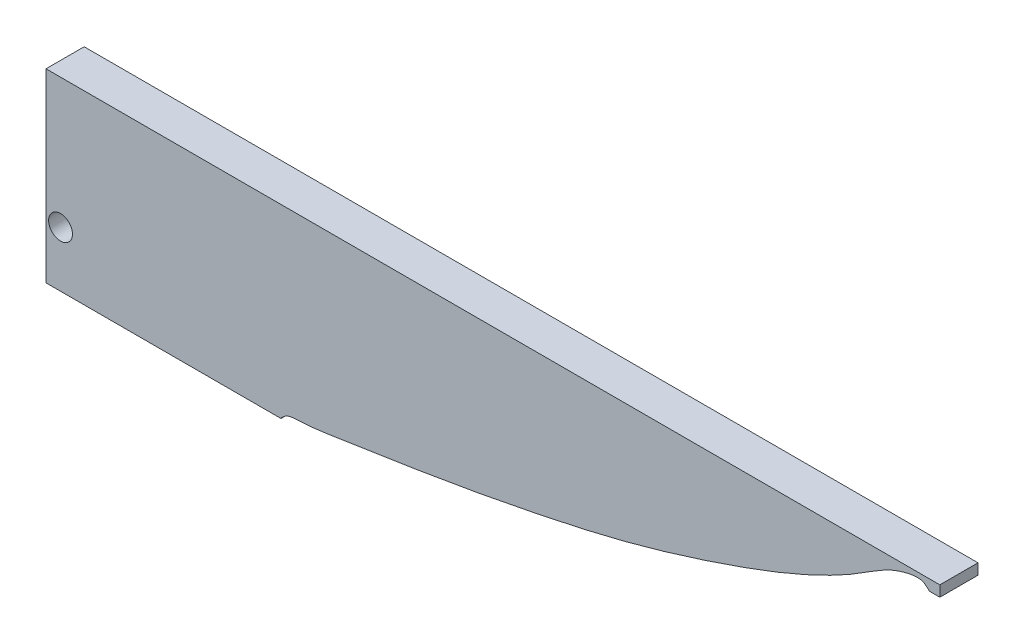
ISO-10303-21;
HEADER;
FILE_DESCRIPTION(('STEP AP214'),'2;1');
FILE_NAME('part.step','',(''),(''),'','','');
FILE_SCHEMA(('AUTOMOTIVE_DESIGN { 1 0 10303 214 1 1 1 1 }'));
ENDSEC;
DATA;
#1=APPLICATION_CONTEXT('core data for automotive mechanical design processes');
#2=APPLICATION_PROTOCOL_DEFINITION('international standard','automotive_design',2000,#1);
#3=PRODUCT_CONTEXT('',#1,'mechanical');
#4=PRODUCT('Part','Part','',(#3));
#5=PRODUCT_RELATED_PRODUCT_CATEGORY('part','',(#4));
#6=PRODUCT_DEFINITION_FORMATION('','',#4);
#7=PRODUCT_DEFINITION_CONTEXT('part definition',#1,'design');
#8=PRODUCT_DEFINITION('design','',#6,#7);
#9=PRODUCT_DEFINITION_SHAPE('','',#8);
#10=(LENGTH_UNIT() NAMED_UNIT(*) SI_UNIT(.MILLI.,.METRE.));
#11=(NAMED_UNIT(*) PLANE_ANGLE_UNIT() SI_UNIT($,.RADIAN.));
#12=(NAMED_UNIT(*) SI_UNIT($,.STERADIAN.) SOLID_ANGLE_UNIT());
#13=UNCERTAINTY_MEASURE_WITH_UNIT(LENGTH_MEASURE(1.E-05),#10,'distance_accuracy_value','');
#14=(GEOMETRIC_REPRESENTATION_CONTEXT(3) GLOBAL_UNCERTAINTY_ASSIGNED_CONTEXT((#13)) GLOBAL_UNIT_ASSIGNED_CONTEXT((#10,
#11,#12)) REPRESENTATION_CONTEXT('',''));
#15=CARTESIAN_POINT('',(0.,0.,0.));
#16=DIRECTION('',(0.,0.,1.));
#17=DIRECTION('',(1.,0.,0.));
#18=AXIS2_PLACEMENT_3D('',#15,#16,#17);
#19=CARTESIAN_POINT('',(-103.0499434486,-36.6152665149148,316.));
#20=CARTESIAN_POINT('',(-86.6293671446559,-36.6145959929747,316.));
#21=CARTESIAN_POINT('',(-70.208790848192,-36.6132473549064,316.));
#22=CARTESIAN_POINT('',(-53.7882146735921,-36.611080000134,316.));
#23=B_SPLINE_CURVE_WITH_KNOTS('',3,(#19,#20,#21,#22),.UNSPECIFIED.,.F.,.F.,(4,4),(0.,1.),.UNSPECIFIED.);
#24=DIRECTION('',(0.,0.,-1.));
#25=VECTOR('',#24,1.);
#26=SURFACE_OF_LINEAR_EXTRUSION('',#23,#25);
#27=CARTESIAN_POINT('',(-103.0499434486,-36.6152665149148,308.));
#28=CARTESIAN_POINT('',(-86.6293671446559,-36.6145959929747,308.));
#29=CARTESIAN_POINT('',(-70.208790848192,-36.6132473549064,308.));
#30=CARTESIAN_POINT('',(-53.7882146735921,-36.611080000134,308.));
#31=B_SPLINE_CURVE_WITH_KNOTS('',3,(#27,#28,#29,#30),.UNSPECIFIED.,.F.,.F.,(4,4),(0.,1.),.UNSPECIFIED.);
#32=CARTESIAN_POINT('',(-103.0499434486,-36.6152665149148,308.));
#33=VERTEX_POINT('',#32);
#34=CARTESIAN_POINT('',(-53.7882146735921,-36.611080000134,308.));
#35=VERTEX_POINT('',#34);
#36=EDGE_CURVE('E177',#33,#35,#31,.T.);
#37=ORIENTED_EDGE('',*,*,#36,.T.);
#38=DIRECTION('',(0.,0.,-1.));
#39=VECTOR('',#38,1.);
#40=CARTESIAN_POINT('',(-53.7882146735921,-36.611080000134,316.));
#41=LINE('',#40,#39);
#42=CARTESIAN_POINT('',(-53.7882146735921,-36.611080000134,316.));
#43=VERTEX_POINT('',#42);
#44=EDGE_CURVE('E11',#43,#35,#41,.T.);
#45=ORIENTED_EDGE('',*,*,#44,.F.);
#46=CARTESIAN_POINT('',(-53.7882146735921,-36.611080000134,316.));
#47=CARTESIAN_POINT('',(-70.208790848192,-36.6132473549064,316.));
#48=CARTESIAN_POINT('',(-86.6293671446559,-36.6145959929747,316.));
#49=CARTESIAN_POINT('',(-103.0499434486,-36.6152665149148,316.));
#50=B_SPLINE_CURVE_WITH_KNOTS('',3,(#46,#47,#48,#49),.UNSPECIFIED.,.F.,.F.,(4,4),(0.,1.),.UNSPECIFIED.);
#51=CARTESIAN_POINT('',(-103.0499434486,-36.6152665149148,316.));
#52=VERTEX_POINT('',#51);
#53=EDGE_CURVE('E160',#52,#43,#50,.F.);
#54=ORIENTED_EDGE('',*,*,#53,.F.);
#55=DIRECTION('',(0.,0.,-1.));
#56=VECTOR('',#55,1.);
#57=CARTESIAN_POINT('',(-103.0499434486,-36.6152665149148,316.));
#58=LINE('',#57,#56);
#59=EDGE_CURVE('E115',#52,#33,#58,.T.);
#60=ORIENTED_EDGE('',*,*,#59,.T.);
#61=EDGE_LOOP('',(#37,#45,#54,#60));
#62=FACE_BOUND('',#61,.T.);
#63=ADVANCED_FACE('F30',(#62),#26,.F.);
#64=CARTESIAN_POINT('',(-53.7882146735921,-36.611080000134,316.));
#65=CARTESIAN_POINT('',(-53.7633793803515,-36.5211439568778,316.));
#66=CARTESIAN_POINT('',(-53.7114426402294,-36.4407479407379,316.));
#67=CARTESIAN_POINT('',(-53.5891526902795,-36.3008263986859,316.));
#68=CARTESIAN_POINT('',(-53.5199721014324,-36.2376721791882,316.));
#69=CARTESIAN_POINT('',(-53.3097634291228,-36.0528952622824,316.));
#70=CARTESIAN_POINT('',(-53.1678510602385,-35.930940585295,316.));
#71=CARTESIAN_POINT('',(-52.8675510325251,-35.7135074719421,316.));
#72=CARTESIAN_POINT('',(-52.71012997802,-35.6162236549799,316.));
#73=CARTESIAN_POINT('',(-52.3716802367749,-35.458775867809,316.));
#74=CARTESIAN_POINT('',(-52.1943373237498,-35.3978540088767,316.));
#75=CARTESIAN_POINT('',(-51.655628824309,-35.2540040122224,316.));
#76=CARTESIAN_POINT('',(-51.2831412294129,-35.2059357697398,316.));
#77=CARTESIAN_POINT('',(-50.5421008915612,-35.1396342375748,316.));
#78=CARTESIAN_POINT('',(-50.1703253258672,-35.1242990605149,316.));
#79=CARTESIAN_POINT('',(-49.4265018173508,-35.0974940652209,316.));
#80=CARTESIAN_POINT('',(-49.0545997858234,-35.0832543873249,316.));
#81=CARTESIAN_POINT('',(-48.3124160368303,-35.0377656879593,316.));
#82=CARTESIAN_POINT('',(-47.9419056507459,-35.0090086900209,316.));
#83=CARTESIAN_POINT('',(-46.8319878236007,-34.9060556914292,316.));
#84=CARTESIAN_POINT('',(-46.0942425003267,-34.8142295349101,316.));
#85=CARTESIAN_POINT('',(-44.6208559324041,-34.6106645415178,316.));
#86=CARTESIAN_POINT('',(-43.8852665857731,-34.5013956356001,316.));
#87=CARTESIAN_POINT('',(-42.4136840474018,-34.2855965206689,316.));
#88=CARTESIAN_POINT('',(-41.6780181277713,-34.1768468985847,316.));
#89=CARTESIAN_POINT('',(-39.4715518247733,-33.8469939361639,316.));
#90=CARTESIAN_POINT('',(-38.0012766688823,-33.6223271661955,316.));
#91=CARTESIAN_POINT('',(-33.5906446190111,-32.9472127827159,316.));
#92=CARTESIAN_POINT('',(-30.650854778901,-32.4929701158712,316.));
#93=CARTESIAN_POINT('',(-24.7740388082393,-31.5669238922862,316.));
#94=CARTESIAN_POINT('',(-21.8377532331228,-31.0906012104106,316.));
#95=CARTESIAN_POINT('',(-15.9726785802088,-30.0933918117648,316.));
#96=CARTESIAN_POINT('',(-13.0441787006727,-29.571258640491,316.));
#97=CARTESIAN_POINT('',(-7.19694611042013,-28.4776480902474,316.));
#98=CARTESIAN_POINT('',(-4.27756509796618,-27.9086687582959,316.));
#99=CARTESIAN_POINT('',(1.55333955443856,-26.7295723857909,316.));
#100=CARTESIAN_POINT('',(4.46522521453754,-26.1212616946924,316.));
#101=CARTESIAN_POINT('',(10.2748354482774,-24.84539911504,316.));
#102=CARTESIAN_POINT('',(13.1722209261598,-24.1752113472498,316.));
#103=CARTESIAN_POINT('',(18.9430305992298,-22.730665435114,316.));
#104=CARTESIAN_POINT('',(21.8162049192984,-21.9557139621582,316.));
#105=CARTESIAN_POINT('',(27.5308064531009,-20.3074931571523,316.));
#106=CARTESIAN_POINT('',(30.3740856521105,-19.4364664184931,316.));
#107=CARTESIAN_POINT('',(36.0390575488102,-17.6221842460543,316.));
#108=CARTESIAN_POINT('',(38.8607698835345,-16.678429628864,316.));
#109=CARTESIAN_POINT('',(44.4724200885189,-14.7030775296724,316.));
#110=CARTESIAN_POINT('',(47.2641507815109,-13.6737006726531,316.));
#111=CARTESIAN_POINT('',(51.4109650230073,-12.02807086643,316.));
#112=CARTESIAN_POINT('',(52.7869023349575,-11.4613422375638,316.));
#113=CARTESIAN_POINT('',(55.5177075670626,-10.2840177834316,316.));
#114=CARTESIAN_POINT('',(56.8716156160605,-9.67325535686045,316.));
#115=CARTESIAN_POINT('',(59.5563478462637,-8.40734796359027,316.));
#116=CARTESIAN_POINT('',(60.8874278243063,-7.75269480846677,316.));
#117=CARTESIAN_POINT('',(63.5192895241834,-6.38513510740794,316.));
#118=CARTESIAN_POINT('',(64.8197106843833,-5.6715353223083,316.));
#119=CARTESIAN_POINT('',(66.7362165207371,-4.53552297026197,316.));
#120=CARTESIAN_POINT('',(67.3695634100841,-4.14629985304818,316.));
#121=CARTESIAN_POINT('',(68.6304443731266,-3.35667752255938,316.));
#122=CARTESIAN_POINT('',(69.2570862736812,-2.95451829121589,316.));
#123=CARTESIAN_POINT('',(71.1427404922854,-1.75937662117253,316.));
#124=CARTESIAN_POINT('',(72.4089733333523,-0.980917544005848,316.));
#125=CARTESIAN_POINT('',(74.4192512247647,-0.0355962255146472,316.));
#126=CARTESIAN_POINT('',(75.1085232210574,0.241063964391508,316.));
#127=CARTESIAN_POINT('',(76.1720865876065,0.596607152892345,316.));
#128=CARTESIAN_POINT('',(76.5325386167469,0.705803657882905,316.));
#129=CARTESIAN_POINT('',(77.2577437436322,0.900725063679778,316.));
#130=CARTESIAN_POINT('',(77.6223921012058,0.986154974046272,316.));
#131=CARTESIAN_POINT('',(78.3563110588217,1.12983256792076,316.));
#132=CARTESIAN_POINT('',(78.7255144043186,1.18847575822524,316.));
#133=CARTESIAN_POINT('',(79.2862941455296,1.23542398013827,316.));
#134=CARTESIAN_POINT('',(79.4743401276476,1.24449047199635,316.));
#135=CARTESIAN_POINT('',(79.8531524245613,1.24662587434846,316.));
#136=CARTESIAN_POINT('',(80.0423908454825,1.23888875491977,316.));
#137=CARTESIAN_POINT('',(80.4158929981655,1.19153895667494,316.));
#138=CARTESIAN_POINT('',(80.6034624659354,1.15045022167296,316.));
#139=CARTESIAN_POINT('',(80.9561950572962,1.01350406990584,316.));
#140=CARTESIAN_POINT('',(81.1165268585406,0.914832736574508,316.));
#141=CARTESIAN_POINT('',(81.4201496875776,0.685396656186403,316.));
#142=CARTESIAN_POINT('',(81.5593973686671,0.556421700502609,316.));
#143=CARTESIAN_POINT('',(81.7741812407888,0.369672405476185,316.));
#144=CARTESIAN_POINT('',(81.8460312129396,0.307712110181946,316.));
#145=CARTESIAN_POINT('',(81.9772708999152,0.169666225581978,316.));
#146=CARTESIAN_POINT('',(82.0335133003581,0.0913600277036851,316.));
#147=CARTESIAN_POINT('',(82.0626870884669,0.,316.));
#148=B_SPLINE_CURVE_WITH_KNOTS('',3,(#64,#65,#66,#67,#68,#69,#70,#71,#72,#73,#74,#75,#76,#77,
#78,#79,#80,#81,#82,#83,#84,#85,#86,#87,#88,#89,#90,#91,#92,#93,#94,#95,#96,#97,#98,#99,#100,
#101,#102,#103,#104,#105,#106,#107,#108,#109,#110,#111,#112,#113,#114,#115,#116,#117,#118,#119,
#120,#121,#122,#123,#124,#125,#126,#127,#128,#129,#130,#131,#132,#133,#134,#135,#136,#137,#138,
#139,#140,#141,#142,#143,#144,#145,#146,#147),.UNSPECIFIED.,.F.,.F.,(4,2,2,2,2,2,2,2,2,2,2,2,2,
2,2,2,2,2,2,2,2,2,2,2,2,2,2,2,2,2,2,2,2,2,2,2,2,2,2,2,2,4),(0.,0.001953125,0.00390625,0.0078125,
0.0117187500000001,0.0156250000000001,0.0234375,0.03125,0.0390624999999999,0.0468749999999999,
0.0625,0.0781250000000001,0.0937500000000002,0.125,0.1875,0.25,0.3125,0.375,0.4375,0.5,0.5625,
0.625,0.6875,0.75,0.78125,0.8125,0.84375,0.875,0.890625,0.90625,0.9375,0.953125,0.9609375,
0.96875,0.9765625,0.98046875,0.984375,0.98828125,0.9921875,0.99609375,0.998046875,1.),.UNSPECIFIED.);
#149=DIRECTION('',(0.,0.,-1.));
#150=VECTOR('',#149,1.);
#151=SURFACE_OF_LINEAR_EXTRUSION('',#148,#150);
#152=CARTESIAN_POINT('',(-53.7882146735921,-36.611080000134,308.));
#153=CARTESIAN_POINT('',(-53.7633793803515,-36.5211439568778,308.));
#154=CARTESIAN_POINT('',(-53.7114426402294,-36.4407479407379,308.));
#155=CARTESIAN_POINT('',(-53.5891526902795,-36.3008263986859,308.));
#156=CARTESIAN_POINT('',(-53.5199721014324,-36.2376721791882,308.));
#157=CARTESIAN_POINT('',(-53.3097634291228,-36.0528952622824,308.));
#158=CARTESIAN_POINT('',(-53.1678510602385,-35.930940585295,308.));
#159=CARTESIAN_POINT('',(-52.8675510325251,-35.7135074719421,308.));
#160=CARTESIAN_POINT('',(-52.71012997802,-35.6162236549799,308.));
#161=CARTESIAN_POINT('',(-52.3716802367749,-35.458775867809,308.));
#162=CARTESIAN_POINT('',(-52.1943373237498,-35.3978540088767,308.));
#163=CARTESIAN_POINT('',(-51.655628824309,-35.2540040122224,308.));
#164=CARTESIAN_POINT('',(-51.2831412294129,-35.2059357697398,308.));
#165=CARTESIAN_POINT('',(-50.5421008915612,-35.1396342375748,308.));
#166=CARTESIAN_POINT('',(-50.1703253258672,-35.1242990605149,308.));
#167=CARTESIAN_POINT('',(-49.4265018173508,-35.0974940652209,308.));
#168=CARTESIAN_POINT('',(-49.0545997858234,-35.0832543873249,308.));
#169=CARTESIAN_POINT('',(-48.3124160368303,-35.0377656879593,308.));
#170=CARTESIAN_POINT('',(-47.9419056507459,-35.0090086900209,308.));
#171=CARTESIAN_POINT('',(-46.8319878236007,-34.9060556914292,308.));
#172=CARTESIAN_POINT('',(-46.0942425003267,-34.8142295349101,308.));
#173=CARTESIAN_POINT('',(-44.6208559324041,-34.6106645415178,308.));
#174=CARTESIAN_POINT('',(-43.8852665857731,-34.5013956356001,308.));
#175=CARTESIAN_POINT('',(-42.4136840474018,-34.2855965206689,308.));
#176=CARTESIAN_POINT('',(-41.6780181277713,-34.1768468985847,308.));
#177=CARTESIAN_POINT('',(-39.4715518247733,-33.8469939361639,308.));
#178=CARTESIAN_POINT('',(-38.0012766688823,-33.6223271661955,308.));
#179=CARTESIAN_POINT('',(-33.5906446190111,-32.9472127827159,308.));
#180=CARTESIAN_POINT('',(-30.650854778901,-32.4929701158712,308.));
#181=CARTESIAN_POINT('',(-24.7740388082393,-31.5669238922862,308.));
#182=CARTESIAN_POINT('',(-21.8377532331228,-31.0906012104106,308.));
#183=CARTESIAN_POINT('',(-15.9726785802088,-30.0933918117648,308.));
#184=CARTESIAN_POINT('',(-13.0441787006727,-29.571258640491,308.));
#185=CARTESIAN_POINT('',(-7.19694611042013,-28.4776480902474,308.));
#186=CARTESIAN_POINT('',(-4.27756509796618,-27.9086687582959,308.));
#187=CARTESIAN_POINT('',(1.55333955443856,-26.7295723857909,308.));
#188=CARTESIAN_POINT('',(4.46522521453754,-26.1212616946924,308.));
#189=CARTESIAN_POINT('',(10.2748354482774,-24.84539911504,308.));
#190=CARTESIAN_POINT('',(13.1722209261598,-24.1752113472498,308.));
#191=CARTESIAN_POINT('',(18.9430305992298,-22.730665435114,308.));
#192=CARTESIAN_POINT('',(21.8162049192984,-21.9557139621582,308.));
#193=CARTESIAN_POINT('',(27.5308064531009,-20.3074931571523,308.));
#194=CARTESIAN_POINT('',(30.3740856521105,-19.4364664184931,308.));
#195=CARTESIAN_POINT('',(36.0390575488102,-17.6221842460543,308.));
#196=CARTESIAN_POINT('',(38.8607698835345,-16.678429628864,308.));
#197=CARTESIAN_POINT('',(44.4724200885189,-14.7030775296724,308.));
#198=CARTESIAN_POINT('',(47.2641507815109,-13.6737006726531,308.));
#199=CARTESIAN_POINT('',(51.4109650230073,-12.02807086643,308.));
#200=CARTESIAN_POINT('',(52.7869023349575,-11.4613422375638,308.));
#201=CARTESIAN_POINT('',(55.5177075670626,-10.2840177834316,308.));
#202=CARTESIAN_POINT('',(56.8716156160605,-9.67325535686045,308.));
#203=CARTESIAN_POINT('',(59.5563478462637,-8.40734796359027,308.));
#204=CARTESIAN_POINT('',(60.8874278243063,-7.75269480846677,308.));
#205=CARTESIAN_POINT('',(63.5192895241834,-6.38513510740794,308.));
#206=CARTESIAN_POINT('',(64.8197106843833,-5.6715353223083,308.));
#207=CARTESIAN_POINT('',(66.7362165207371,-4.53552297026197,308.));
#208=CARTESIAN_POINT('',(67.3695634100841,-4.14629985304818,308.));
#209=CARTESIAN_POINT('',(68.6304443731266,-3.35667752255938,308.));
#210=CARTESIAN_POINT('',(69.2570862736812,-2.95451829121589,308.));
#211=CARTESIAN_POINT('',(71.1427404922854,-1.75937662117253,308.));
#212=CARTESIAN_POINT('',(72.4089733333523,-0.980917544005848,308.));
#213=CARTESIAN_POINT('',(74.4192512247647,-0.0355962255146472,308.));
#214=CARTESIAN_POINT('',(75.1085232210574,0.241063964391508,308.));
#215=CARTESIAN_POINT('',(76.1720865876065,0.596607152892345,308.));
#216=CARTESIAN_POINT('',(76.5325386167469,0.705803657882905,308.));
#217=CARTESIAN_POINT('',(77.2577437436322,0.900725063679778,308.));
#218=CARTESIAN_POINT('',(77.6223921012058,0.986154974046272,308.));
#219=CARTESIAN_POINT('',(78.3563110588217,1.12983256792076,308.));
#220=CARTESIAN_POINT('',(78.7255144043186,1.18847575822524,308.));
#221=CARTESIAN_POINT('',(79.2862941455296,1.23542398013827,308.));
#222=CARTESIAN_POINT('',(79.4743401276476,1.24449047199635,308.));
#223=CARTESIAN_POINT('',(79.8531524245613,1.24662587434846,308.));
#224=CARTESIAN_POINT('',(80.0423908454825,1.23888875491977,308.));
#225=CARTESIAN_POINT('',(80.4158929981655,1.19153895667494,308.));
#226=CARTESIAN_POINT('',(80.6034624659354,1.15045022167296,308.));
#227=CARTESIAN_POINT('',(80.9561950572962,1.01350406990584,308.));
#228=CARTESIAN_POINT('',(81.1165268585406,0.914832736574508,308.));
#229=CARTESIAN_POINT('',(81.4201496875776,0.685396656186403,308.));
#230=CARTESIAN_POINT('',(81.5593973686671,0.556421700502609,308.));
#231=CARTESIAN_POINT('',(81.7741812407888,0.369672405476185,308.));
#232=CARTESIAN_POINT('',(81.8460312129396,0.307712110181946,308.));
#233=CARTESIAN_POINT('',(81.9772708999152,0.169666225581978,308.));
#234=CARTESIAN_POINT('',(82.0335133003581,0.0913600277036851,308.));
#235=CARTESIAN_POINT('',(82.0626870884669,0.,308.));
#236=B_SPLINE_CURVE_WITH_KNOTS('',3,(#152,#153,#154,#155,#156,#157,#158,#159,#160,#161,#162,
#163,#164,#165,#166,#167,#168,#169,#170,#171,#172,#173,#174,#175,#176,#177,#178,#179,#180,#181,
#182,#183,#184,#185,#186,#187,#188,#189,#190,#191,#192,#193,#194,#195,#196,#197,#198,#199,#200,
#201,#202,#203,#204,#205,#206,#207,#208,#209,#210,#211,#212,#213,#214,#215,#216,#217,#218,#219,
#220,#221,#222,#223,#224,#225,#226,#227,#228,#229,#230,#231,#232,#233,#234,#235),.UNSPECIFIED.,
.F.,.F.,(4,2,2,2,2,2,2,2,2,2,2,2,2,2,2,2,2,2,2,2,2,2,2,2,2,2,2,2,2,2,2,2,2,2,2,2,2,2,2,2,2,4),
(0.,0.001953125,0.00390625,0.0078125,0.0117187500000001,0.0156250000000001,0.0234375,0.03125,
0.0390624999999999,0.0468749999999999,0.0625,0.0781250000000001,0.0937500000000002,0.125,0.1875,
0.25,0.3125,0.375,0.4375,0.5,0.5625,0.625,0.6875,0.75,0.78125,0.8125,0.84375,0.875,0.890625,
0.90625,0.9375,0.953125,0.9609375,0.96875,0.9765625,0.98046875,0.984375,0.98828125,0.9921875,
0.99609375,0.998046875,1.),.UNSPECIFIED.);
#237=CARTESIAN_POINT('',(82.0626870884669,0.,308.));
#238=VERTEX_POINT('',#237);
#239=EDGE_CURVE('E203',#35,#238,#236,.T.);
#240=ORIENTED_EDGE('',*,*,#239,.T.);
#241=DIRECTION('',(0.,0.,-1.));
#242=VECTOR('',#241,1.);
#243=CARTESIAN_POINT('',(82.0626870884669,0.,316.));
#244=LINE('',#243,#242);
#245=CARTESIAN_POINT('',(82.0626870884669,0.,316.));
#246=VERTEX_POINT('',#245);
#247=EDGE_CURVE('E41',#246,#238,#244,.T.);
#248=ORIENTED_EDGE('',*,*,#247,.F.);
#249=CARTESIAN_POINT('',(82.0626870884669,0.,316.));
#250=CARTESIAN_POINT('',(82.0335133003581,0.0913600277036851,316.));
#251=CARTESIAN_POINT('',(81.9772708999152,0.169666225581978,316.));
#252=CARTESIAN_POINT('',(81.8460312129396,0.307712110181946,316.));
#253=CARTESIAN_POINT('',(81.7741812407888,0.369672405476185,316.));
#254=CARTESIAN_POINT('',(81.5593973686671,0.556421700502609,316.));
#255=CARTESIAN_POINT('',(81.4201496875776,0.685396656186403,316.));
#256=CARTESIAN_POINT('',(81.1165268585406,0.914832736574508,316.));
#257=CARTESIAN_POINT('',(80.9561950572962,1.01350406990584,316.));
#258=CARTESIAN_POINT('',(80.6034624659354,1.15045022167296,316.));
#259=CARTESIAN_POINT('',(80.4158929981655,1.19153895667494,316.));
#260=CARTESIAN_POINT('',(80.0423908454825,1.23888875491977,316.));
#261=CARTESIAN_POINT('',(79.8531524245613,1.24662587434846,316.));
#262=CARTESIAN_POINT('',(79.4743401276476,1.24449047199635,316.));
#263=CARTESIAN_POINT('',(79.2862941455296,1.23542398013827,316.));
#264=CARTESIAN_POINT('',(78.7255144043186,1.18847575822524,316.));
#265=CARTESIAN_POINT('',(78.3563110588217,1.12983256792076,316.));
#266=CARTESIAN_POINT('',(77.6223921012058,0.986154974046272,316.));
#267=CARTESIAN_POINT('',(77.2577437436322,0.900725063679778,316.));
#268=CARTESIAN_POINT('',(76.5325386167469,0.705803657882905,316.));
#269=CARTESIAN_POINT('',(76.1720865876065,0.596607152892345,316.));
#270=CARTESIAN_POINT('',(75.1085232210574,0.241063964391508,316.));
#271=CARTESIAN_POINT('',(74.4192512247647,-0.0355962255146472,316.));
#272=CARTESIAN_POINT('',(72.4089733333523,-0.980917544005848,316.));
#273=CARTESIAN_POINT('',(71.1427404922854,-1.75937662117253,316.));
#274=CARTESIAN_POINT('',(69.2570862736812,-2.95451829121589,316.));
#275=CARTESIAN_POINT('',(68.6304443731266,-3.35667752255938,316.));
#276=CARTESIAN_POINT('',(67.3695634100841,-4.14629985304818,316.));
#277=CARTESIAN_POINT('',(66.7362165207371,-4.53552297026197,316.));
#278=CARTESIAN_POINT('',(64.8197106843833,-5.6715353223083,316.));
#279=CARTESIAN_POINT('',(63.5192895241834,-6.38513510740794,316.));
#280=CARTESIAN_POINT('',(60.8874278243063,-7.75269480846677,316.));
#281=CARTESIAN_POINT('',(59.5563478462637,-8.40734796359027,316.));
#282=CARTESIAN_POINT('',(56.8716156160605,-9.67325535686045,316.));
#283=CARTESIAN_POINT('',(55.5177075670626,-10.2840177834316,316.));
#284=CARTESIAN_POINT('',(52.7869023349575,-11.4613422375638,316.));
#285=CARTESIAN_POINT('',(51.4109650230073,-12.02807086643,316.));
#286=CARTESIAN_POINT('',(47.2641507815109,-13.6737006726531,316.));
#287=CARTESIAN_POINT('',(44.4724200885189,-14.7030775296724,316.));
#288=CARTESIAN_POINT('',(38.8607698835345,-16.678429628864,316.));
#289=CARTESIAN_POINT('',(36.0390575488102,-17.6221842460543,316.));
#290=CARTESIAN_POINT('',(30.3740856521105,-19.4364664184931,316.));
#291=CARTESIAN_POINT('',(27.5308064531009,-20.3074931571523,316.));
#292=CARTESIAN_POINT('',(21.8162049192984,-21.9557139621582,316.));
#293=CARTESIAN_POINT('',(18.9430305992298,-22.730665435114,316.));
#294=CARTESIAN_POINT('',(13.1722209261598,-24.1752113472498,316.));
#295=CARTESIAN_POINT('',(10.2748354482774,-24.84539911504,316.));
#296=CARTESIAN_POINT('',(4.46522521453754,-26.1212616946924,316.));
#297=CARTESIAN_POINT('',(1.55333955443856,-26.7295723857909,316.));
#298=CARTESIAN_POINT('',(-4.27756509796618,-27.9086687582959,316.));
#299=CARTESIAN_POINT('',(-7.19694611042013,-28.4776480902474,316.));
#300=CARTESIAN_POINT('',(-13.0441787006727,-29.571258640491,316.));
#301=CARTESIAN_POINT('',(-15.9726785802088,-30.0933918117648,316.));
#302=CARTESIAN_POINT('',(-21.8377532331228,-31.0906012104106,316.));
#303=CARTESIAN_POINT('',(-24.7740388082393,-31.5669238922862,316.));
#304=CARTESIAN_POINT('',(-30.650854778901,-32.4929701158712,316.));
#305=CARTESIAN_POINT('',(-33.5906446190111,-32.9472127827159,316.));
#306=CARTESIAN_POINT('',(-38.0012766688823,-33.6223271661955,316.));
#307=CARTESIAN_POINT('',(-39.4715518247733,-33.8469939361639,316.));
#308=CARTESIAN_POINT('',(-41.6780181277713,-34.1768468985847,316.));
#309=CARTESIAN_POINT('',(-42.4136840474018,-34.2855965206689,316.));
#310=CARTESIAN_POINT('',(-43.8852665857731,-34.5013956356001,316.));
#311=CARTESIAN_POINT('',(-44.6208559324041,-34.6106645415178,316.));
#312=CARTESIAN_POINT('',(-46.0942425003267,-34.8142295349101,316.));
#313=CARTESIAN_POINT('',(-46.8319878236007,-34.9060556914292,316.));
#314=CARTESIAN_POINT('',(-47.9419056507459,-35.0090086900209,316.));
#315=CARTESIAN_POINT('',(-48.3124160368303,-35.0377656879593,316.));
#316=CARTESIAN_POINT('',(-49.0545997858234,-35.0832543873249,316.));
#317=CARTESIAN_POINT('',(-49.4265018173508,-35.0974940652209,316.));
#318=CARTESIAN_POINT('',(-50.1703253258672,-35.1242990605149,316.));
#319=CARTESIAN_POINT('',(-50.5421008915612,-35.1396342375748,316.));
#320=CARTESIAN_POINT('',(-51.2831412294129,-35.2059357697398,316.));
#321=CARTESIAN_POINT('',(-51.655628824309,-35.2540040122224,316.));
#322=CARTESIAN_POINT('',(-52.1943373237498,-35.3978540088767,316.));
#323=CARTESIAN_POINT('',(-52.3716802367749,-35.458775867809,316.));
#324=CARTESIAN_POINT('',(-52.71012997802,-35.6162236549799,316.));
#325=CARTESIAN_POINT('',(-52.8675510325251,-35.7135074719421,316.));
#326=CARTESIAN_POINT('',(-53.1678510602385,-35.930940585295,316.));
#327=CARTESIAN_POINT('',(-53.3097634291228,-36.0528952622824,316.));
#328=CARTESIAN_POINT('',(-53.5199721014324,-36.2376721791882,316.));
#329=CARTESIAN_POINT('',(-53.5891526902795,-36.3008263986859,316.));
#330=CARTESIAN_POINT('',(-53.7114426402294,-36.4407479407379,316.));
#331=CARTESIAN_POINT('',(-53.7633793803515,-36.5211439568778,316.));
#332=CARTESIAN_POINT('',(-53.7882146735921,-36.611080000134,316.));
#333=B_SPLINE_CURVE_WITH_KNOTS('',3,(#249,#250,#251,#252,#253,#254,#255,#256,#257,#258,#259,
#260,#261,#262,#263,#264,#265,#266,#267,#268,#269,#270,#271,#272,#273,#274,#275,#276,#277,#278,
#279,#280,#281,#282,#283,#284,#285,#286,#287,#288,#289,#290,#291,#292,#293,#294,#295,#296,#297,
#298,#299,#300,#301,#302,#303,#304,#305,#306,#307,#308,#309,#310,#311,#312,#313,#314,#315,#316,
#317,#318,#319,#320,#321,#322,#323,#324,#325,#326,#327,#328,#329,#330,#331,#332),.UNSPECIFIED.,
.F.,.F.,(4,2,2,2,2,2,2,2,2,2,2,2,2,2,2,2,2,2,2,2,2,2,2,2,2,2,2,2,2,2,2,2,2,2,2,2,2,2,2,2,2,4),
(0.,0.001953125,0.00390625,0.0078125,0.0117187500000001,0.0156250000000001,0.0195312500000001,
0.0234375000000002,0.0312500000000002,0.0390625000000003,0.0468750000000003,0.0625000000000002,
0.0937500000000001,0.109375,0.125,0.15625,0.1875,0.21875,0.25,0.3125,0.375,0.4375,0.5,0.5625,
0.625,0.6875,0.75,0.8125,0.875,0.90625,0.921875,0.9375,0.953125,0.9609375,0.96875,0.9765625,
0.984375,0.98828125,0.9921875,0.99609375,0.998046875,1.),.UNSPECIFIED.);
#334=EDGE_CURVE('E87',#43,#246,#333,.F.);
#335=ORIENTED_EDGE('',*,*,#334,.F.);
#336=ORIENTED_EDGE('',*,*,#44,.T.);
#337=EDGE_LOOP('',(#240,#248,#335,#336));
#338=FACE_BOUND('',#337,.T.);
#339=ADVANCED_FACE('F209',(#338),#151,.F.);
#340=CARTESIAN_POINT('',(82.0626870884669,0.,316.));
#341=DIRECTION('',(0.,1.,0.));
#342=DIRECTION('',(-1.,0.,0.));
#343=AXIS2_PLACEMENT_3D('',#340,#341,#342);
#344=PLANE('',#343);
#345=DIRECTION('',(1.,0.,0.));
#346=VECTOR('',#345,1.);
#347=CARTESIAN_POINT('',(82.0626870884669,0.,308.));
#348=LINE('',#347,#346);
#349=CARTESIAN_POINT('',(84.3343190539735,0.,308.));
#350=VERTEX_POINT('',#349);
#351=EDGE_CURVE('E120',#238,#350,#348,.T.);
#352=ORIENTED_EDGE('',*,*,#351,.T.);
#353=DIRECTION('',(0.,0.,-1.));
#354=VECTOR('',#353,1.);
#355=CARTESIAN_POINT('',(84.3343190539735,0.,316.));
#356=LINE('',#355,#354);
#357=CARTESIAN_POINT('',(84.3343190539735,0.,316.));
#358=VERTEX_POINT('',#357);
#359=EDGE_CURVE('E110',#358,#350,#356,.T.);
#360=ORIENTED_EDGE('',*,*,#359,.F.);
#361=DIRECTION('',(1.,0.,0.));
#362=VECTOR('',#361,1.);
#363=CARTESIAN_POINT('',(82.0626870884669,0.,316.));
#364=LINE('',#363,#362);
#365=EDGE_CURVE('E101',#246,#358,#364,.T.);
#366=ORIENTED_EDGE('',*,*,#365,.F.);
#367=ORIENTED_EDGE('',*,*,#247,.T.);
#368=EDGE_LOOP('',(#352,#360,#366,#367));
#369=FACE_BOUND('',#368,.T.);
#370=ADVANCED_FACE('F218',(#369),#344,.F.);
#371=CARTESIAN_POINT('',(84.3343190539735,2.25600000000004,316.));
#372=DIRECTION('',(-1.,0.,0.));
#373=DIRECTION('',(0.,0.,1.));
#374=AXIS2_PLACEMENT_3D('',#371,#372,#373);
#375=PLANE('',#374);
#376=DIRECTION('',(0.,1.,0.));
#377=VECTOR('',#376,1.);
#378=CARTESIAN_POINT('',(84.3343190539735,2.25600000000004,308.));
#379=LINE('',#378,#377);
#380=CARTESIAN_POINT('',(84.3343190539735,2.25600000000004,308.));
#381=VERTEX_POINT('',#380);
#382=EDGE_CURVE('E109',#350,#381,#379,.T.);
#383=ORIENTED_EDGE('',*,*,#382,.T.);
#384=DIRECTION('',(0.,0.,-1.));
#385=VECTOR('',#384,1.);
#386=CARTESIAN_POINT('',(84.3343190539735,2.25600000000004,316.));
#387=LINE('',#386,#385);
#388=CARTESIAN_POINT('',(84.3343190539735,2.25600000000004,316.));
#389=VERTEX_POINT('',#388);
#390=EDGE_CURVE('E106',#389,#381,#387,.T.);
#391=ORIENTED_EDGE('',*,*,#390,.F.);
#392=DIRECTION('',(0.,1.,0.));
#393=VECTOR('',#392,1.);
#394=CARTESIAN_POINT('',(84.3343190539735,2.25600000000004,316.));
#395=LINE('',#394,#393);
#396=EDGE_CURVE('E95',#358,#389,#395,.T.);
#397=ORIENTED_EDGE('',*,*,#396,.F.);
#398=ORIENTED_EDGE('',*,*,#359,.T.);
#399=EDGE_LOOP('',(#383,#391,#397,#398));
#400=FACE_BOUND('',#399,.T.);
#401=ADVANCED_FACE('F107',(#400),#375,.F.);
#402=CARTESIAN_POINT('',(84.3343190539735,2.25600000000004,316.));
#403=DIRECTION('',(0.,-1.,0.));
#404=DIRECTION('',(1.,0.,0.));
#405=AXIS2_PLACEMENT_3D('',#402,#403,#404);
#406=PLANE('',#405);
#407=DIRECTION('',(-1.,0.,0.));
#408=VECTOR('',#407,1.);
#409=CARTESIAN_POINT('',(84.3343190539735,2.25600000000004,308.));
#410=LINE('',#409,#408);
#411=CARTESIAN_POINT('',(-103.0499434486,2.25600000000003,308.));
#412=VERTEX_POINT('',#411);
#413=EDGE_CURVE('E73',#381,#412,#410,.T.);
#414=ORIENTED_EDGE('',*,*,#413,.T.);
#415=DIRECTION('',(0.,0.,-1.));
#416=VECTOR('',#415,1.);
#417=CARTESIAN_POINT('',(-103.0499434486,2.25600000000003,316.));
#418=LINE('',#417,#416);
#419=CARTESIAN_POINT('',(-103.0499434486,2.25600000000003,316.));
#420=VERTEX_POINT('',#419);
#421=EDGE_CURVE('E111',#420,#412,#418,.T.);
#422=ORIENTED_EDGE('',*,*,#421,.F.);
#423=DIRECTION('',(-1.,0.,0.));
#424=VECTOR('',#423,1.);
#425=CARTESIAN_POINT('',(84.3343190539735,2.25600000000004,316.));
#426=LINE('',#425,#424);
#427=EDGE_CURVE('E99',#389,#420,#426,.T.);
#428=ORIENTED_EDGE('',*,*,#427,.F.);
#429=ORIENTED_EDGE('',*,*,#390,.T.);
#430=EDGE_LOOP('',(#414,#422,#428,#429));
#431=FACE_BOUND('',#430,.T.);
#432=ADVANCED_FACE('F113',(#431),#406,.F.);
#433=CARTESIAN_POINT('',(-103.0499434486,-36.6152665149148,316.));
#434=DIRECTION('',(1.,0.,0.));
#435=DIRECTION('',(0.,1.,0.));
#436=AXIS2_PLACEMENT_3D('',#433,#434,#435);
#437=PLANE('',#436);
#438=DIRECTION('',(0.,-1.,0.));
#439=VECTOR('',#438,1.);
#440=CARTESIAN_POINT('',(-103.0499434486,-36.6152665149148,308.));
#441=LINE('',#440,#439);
#442=EDGE_CURVE('E79',#412,#33,#441,.T.);
#443=ORIENTED_EDGE('',*,*,#442,.T.);
#444=ORIENTED_EDGE('',*,*,#59,.F.);
#445=DIRECTION('',(0.,-1.,0.));
#446=VECTOR('',#445,1.);
#447=CARTESIAN_POINT('',(-103.0499434486,-36.6152665149148,316.));
#448=LINE('',#447,#446);
#449=EDGE_CURVE('E50',#420,#52,#448,.T.);
#450=ORIENTED_EDGE('',*,*,#449,.F.);
#451=ORIENTED_EDGE('',*,*,#421,.T.);
#452=EDGE_LOOP('',(#443,#444,#450,#451));
#453=FACE_BOUND('',#452,.T.);
#454=ADVANCED_FACE('F139',(#453),#437,.F.);
#455=CARTESIAN_POINT('',(-78.419079012592,-36.6137345698365,316.));
#456=DIRECTION('',(0.,0.,-1.));
#457=DIRECTION('',(-1.,0.,0.));
#458=AXIS2_PLACEMENT_3D('',#455,#456,#457);
#459=PLANE('',#458);
#460=CARTESIAN_POINT('',(-100.,-25.,316.));
#461=DIRECTION('',(0.,0.,-1.));
#462=DIRECTION('',(-1.,0.,0.));
#463=AXIS2_PLACEMENT_3D('',#460,#461,#462);
#464=CIRCLE('',#463,2.5);
#465=CARTESIAN_POINT('',(-102.5,-25.,316.));
#466=VERTEX_POINT('',#465);
#467=EDGE_CURVE('E231',#466,#466,#464,.T.);
#468=ORIENTED_EDGE('',*,*,#467,.T.);
#469=EDGE_LOOP('',(#468));
#470=FACE_BOUND('',#469,.T.);
#471=ORIENTED_EDGE('',*,*,#53,.T.);
#472=ORIENTED_EDGE('',*,*,#334,.T.);
#473=ORIENTED_EDGE('',*,*,#365,.T.);
#474=ORIENTED_EDGE('',*,*,#396,.T.);
#475=ORIENTED_EDGE('',*,*,#427,.T.);
#476=ORIENTED_EDGE('',*,*,#449,.T.);
#477=EDGE_LOOP('',(#471,#472,#473,#474,#475,#476));
#478=FACE_BOUND('',#477,.T.);
#479=ADVANCED_FACE('F97',(#470,#478),#459,.F.);
#480=CARTESIAN_POINT('',(-78.419079012592,-36.6137345698365,308.));
#481=DIRECTION('',(0.,0.,-1.));
#482=DIRECTION('',(-1.,0.,0.));
#483=AXIS2_PLACEMENT_3D('',#480,#481,#482);
#484=PLANE('',#483);
#485=CARTESIAN_POINT('',(-100.,-25.,308.));
#486=DIRECTION('',(0.,0.,1.));
#487=DIRECTION('',(1.,0.,0.));
#488=AXIS2_PLACEMENT_3D('',#485,#486,#487);
#489=CIRCLE('',#488,2.5);
#490=CARTESIAN_POINT('',(-97.5,-25.,308.));
#491=VERTEX_POINT('',#490);
#492=EDGE_CURVE('E237',#491,#491,#489,.T.);
#493=ORIENTED_EDGE('',*,*,#492,.T.);
#494=EDGE_LOOP('',(#493));
#495=FACE_BOUND('',#494,.T.);
#496=ORIENTED_EDGE('',*,*,#351,.F.);
#497=ORIENTED_EDGE('',*,*,#239,.F.);
#498=ORIENTED_EDGE('',*,*,#36,.F.);
#499=ORIENTED_EDGE('',*,*,#442,.F.);
#500=ORIENTED_EDGE('',*,*,#413,.F.);
#501=ORIENTED_EDGE('',*,*,#382,.F.);
#502=EDGE_LOOP('',(#496,#497,#498,#499,#500,#501));
#503=FACE_BOUND('',#502,.T.);
#504=ADVANCED_FACE('F138',(#495,#503),#484,.T.);
#505=CARTESIAN_POINT('',(-100.,-25.,308.));
#506=DIRECTION('',(0.,0.,1.));
#507=DIRECTION('',(1.,0.,0.));
#508=AXIS2_PLACEMENT_3D('',#505,#506,#507);
#509=CYLINDRICAL_SURFACE('',#508,2.5);
#510=ORIENTED_EDGE('',*,*,#492,.F.);
#511=EDGE_LOOP('',(#510));
#512=FACE_BOUND('',#511,.T.);
#513=ORIENTED_EDGE('',*,*,#467,.F.);
#514=EDGE_LOOP('',(#513));
#515=FACE_BOUND('',#514,.T.);
#516=ADVANCED_FACE('F141',(#512,#515),#509,.F.);
#517=CLOSED_SHELL('',(#63,#339,#370,#401,#432,#454,#479,#504,#516));
#518=MANIFOLD_SOLID_BREP('B2',#517);
#519=ADVANCED_BREP_SHAPE_REPRESENTATION('',(#18,#518),#14);
#520=SHAPE_DEFINITION_REPRESENTATION(#9,#519);
ENDSEC;
END-ISO-10303-21;
